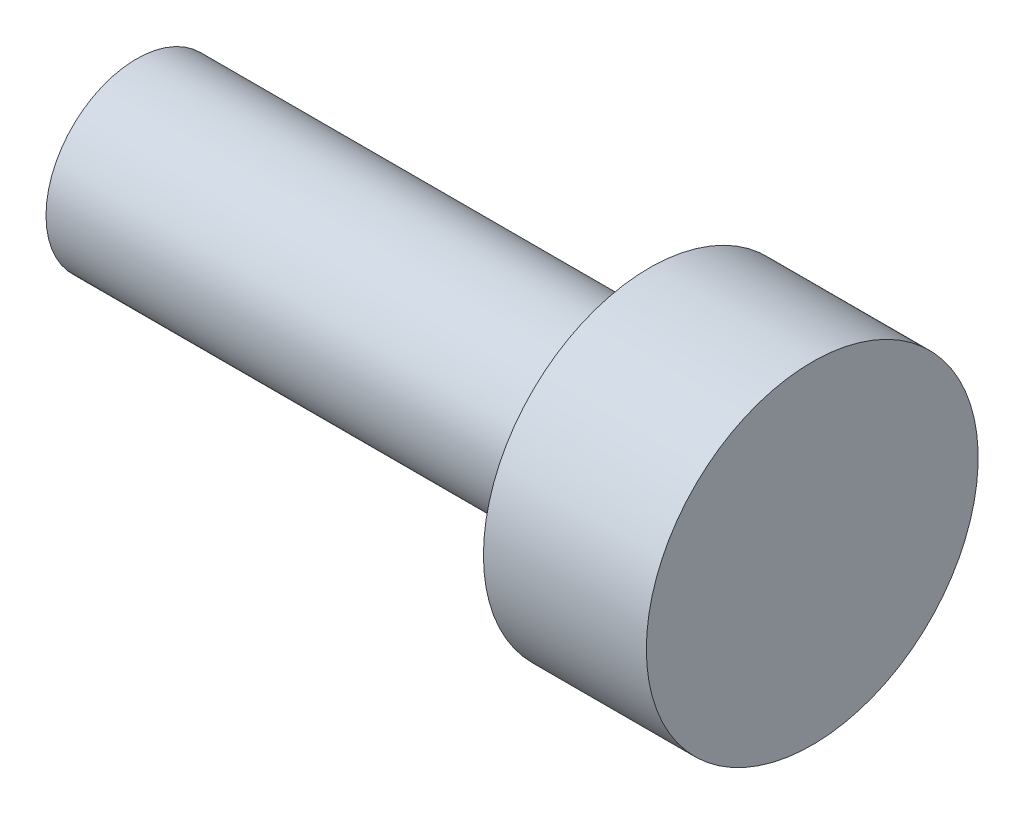
ISO-10303-21;
HEADER;
FILE_DESCRIPTION(('STEP AP214'),'2;1');
FILE_NAME('part.step','',(''),(''),'','','');
FILE_SCHEMA(('AUTOMOTIVE_DESIGN { 1 0 10303 214 1 1 1 1 }'));
ENDSEC;
DATA;
#1=APPLICATION_CONTEXT('core data for automotive mechanical design processes');
#2=APPLICATION_PROTOCOL_DEFINITION('international standard','automotive_design',2000,#1);
#3=PRODUCT_CONTEXT('',#1,'mechanical');
#4=PRODUCT('Part','Part','',(#3));
#5=PRODUCT_RELATED_PRODUCT_CATEGORY('part','',(#4));
#6=PRODUCT_DEFINITION_FORMATION('','',#4);
#7=PRODUCT_DEFINITION_CONTEXT('part definition',#1,'design');
#8=PRODUCT_DEFINITION('design','',#6,#7);
#9=PRODUCT_DEFINITION_SHAPE('','',#8);
#10=(LENGTH_UNIT() NAMED_UNIT(*) SI_UNIT(.MILLI.,.METRE.));
#11=(NAMED_UNIT(*) PLANE_ANGLE_UNIT() SI_UNIT($,.RADIAN.));
#12=(NAMED_UNIT(*) SI_UNIT($,.STERADIAN.) SOLID_ANGLE_UNIT());
#13=UNCERTAINTY_MEASURE_WITH_UNIT(LENGTH_MEASURE(1.E-05),#10,'distance_accuracy_value','');
#14=(GEOMETRIC_REPRESENTATION_CONTEXT(3) GLOBAL_UNCERTAINTY_ASSIGNED_CONTEXT((#13)) GLOBAL_UNIT_ASSIGNED_CONTEXT((#10,
#11,#12)) REPRESENTATION_CONTEXT('',''));
#15=CARTESIAN_POINT('',(0.,0.,0.));
#16=DIRECTION('',(0.,0.,1.));
#17=DIRECTION('',(1.,0.,0.));
#18=AXIS2_PLACEMENT_3D('',#15,#16,#17);
#19=CARTESIAN_POINT('',(165.5,1.5,0.));
#20=DIRECTION('',(1.,0.,0.));
#21=DIRECTION('',(0.,0.,-1.));
#22=AXIS2_PLACEMENT_3D('',#19,#20,#21);
#23=PLANE('',#22);
#24=CARTESIAN_POINT('',(165.5,0.,0.));
#25=DIRECTION('',(-1.,0.,0.));
#26=DIRECTION('',(0.,0.,1.));
#27=AXIS2_PLACEMENT_3D('',#24,#25,#26);
#28=CIRCLE('',#27,1.5);
#29=CARTESIAN_POINT('',(165.5,0.,1.5));
#30=VERTEX_POINT('',#29);
#31=EDGE_CURVE('E45',#30,#30,#28,.T.);
#32=ORIENTED_EDGE('',*,*,#31,.T.);
#33=EDGE_LOOP('',(#32));
#34=FACE_BOUND('',#33,.T.);
#35=ADVANCED_FACE('F31',(#34),#23,.F.);
#36=CARTESIAN_POINT('',(176.7,0.,0.));
#37=DIRECTION('',(-1.,0.,0.));
#38=DIRECTION('',(0.,0.,1.));
#39=AXIS2_PLACEMENT_3D('',#36,#37,#38);
#40=PLANE('',#39);
#41=CARTESIAN_POINT('',(176.7,0.,0.));
#42=DIRECTION('',(-1.,0.,0.));
#43=DIRECTION('',(0.,0.,1.));
#44=AXIS2_PLACEMENT_3D('',#41,#42,#43);
#45=CIRCLE('',#44,2.75);
#46=CARTESIAN_POINT('',(176.7,0.,2.75));
#47=VERTEX_POINT('',#46);
#48=EDGE_CURVE('E10',#47,#47,#45,.T.);
#49=ORIENTED_EDGE('',*,*,#48,.F.);
#50=EDGE_LOOP('',(#49));
#51=FACE_BOUND('',#50,.T.);
#52=ADVANCED_FACE('F65',(#51),#40,.F.);
#53=CARTESIAN_POINT('',(-110.,0.,0.));
#54=DIRECTION('',(-1.,0.,0.));
#55=DIRECTION('',(0.,0.,1.));
#56=AXIS2_PLACEMENT_3D('',#53,#54,#55);
#57=CYLINDRICAL_SURFACE('',#56,2.75);
#58=CARTESIAN_POINT('',(174.,0.,0.));
#59=DIRECTION('',(-1.,0.,0.));
#60=DIRECTION('',(0.,0.,1.));
#61=AXIS2_PLACEMENT_3D('',#58,#59,#60);
#62=CIRCLE('',#61,2.75);
#63=CARTESIAN_POINT('',(174.,0.,2.75));
#64=VERTEX_POINT('',#63);
#65=EDGE_CURVE('E37',#64,#64,#62,.T.);
#66=ORIENTED_EDGE('',*,*,#65,.F.);
#67=EDGE_LOOP('',(#66));
#68=FACE_BOUND('',#67,.T.);
#69=ORIENTED_EDGE('',*,*,#48,.T.);
#70=EDGE_LOOP('',(#69));
#71=FACE_BOUND('',#70,.T.);
#72=ADVANCED_FACE('F60',(#68,#71),#57,.T.);
#73=CARTESIAN_POINT('',(174.,2.75,0.));
#74=DIRECTION('',(1.,0.,0.));
#75=DIRECTION('',(0.,0.,-1.));
#76=AXIS2_PLACEMENT_3D('',#73,#74,#75);
#77=PLANE('',#76);
#78=CARTESIAN_POINT('',(174.,0.,0.));
#79=DIRECTION('',(-1.,0.,0.));
#80=DIRECTION('',(0.,0.,1.));
#81=AXIS2_PLACEMENT_3D('',#78,#79,#80);
#82=CIRCLE('',#81,1.5);
#83=CARTESIAN_POINT('',(174.,0.,1.5));
#84=VERTEX_POINT('',#83);
#85=EDGE_CURVE('E41',#84,#84,#82,.T.);
#86=ORIENTED_EDGE('',*,*,#85,.F.);
#87=EDGE_LOOP('',(#86));
#88=FACE_BOUND('',#87,.T.);
#89=ORIENTED_EDGE('',*,*,#65,.T.);
#90=EDGE_LOOP('',(#89));
#91=FACE_BOUND('',#90,.T.);
#92=ADVANCED_FACE('F55',(#88,#91),#77,.F.);
#93=CARTESIAN_POINT('',(-110.,0.,0.));
#94=DIRECTION('',(-1.,0.,0.));
#95=DIRECTION('',(0.,0.,1.));
#96=AXIS2_PLACEMENT_3D('',#93,#94,#95);
#97=CYLINDRICAL_SURFACE('',#96,1.5);
#98=ORIENTED_EDGE('',*,*,#31,.F.);
#99=EDGE_LOOP('',(#98));
#100=FACE_BOUND('',#99,.T.);
#101=ORIENTED_EDGE('',*,*,#85,.T.);
#102=EDGE_LOOP('',(#101));
#103=FACE_BOUND('',#102,.T.);
#104=ADVANCED_FACE('F52',(#100,#103),#97,.T.);
#105=CLOSED_SHELL('',(#35,#52,#72,#92,#104));
#106=MANIFOLD_SOLID_BREP('B2',#105);
#107=ADVANCED_BREP_SHAPE_REPRESENTATION('',(#18,#106),#14);
#108=SHAPE_DEFINITION_REPRESENTATION(#9,#107);
ENDSEC;
END-ISO-10303-21;
